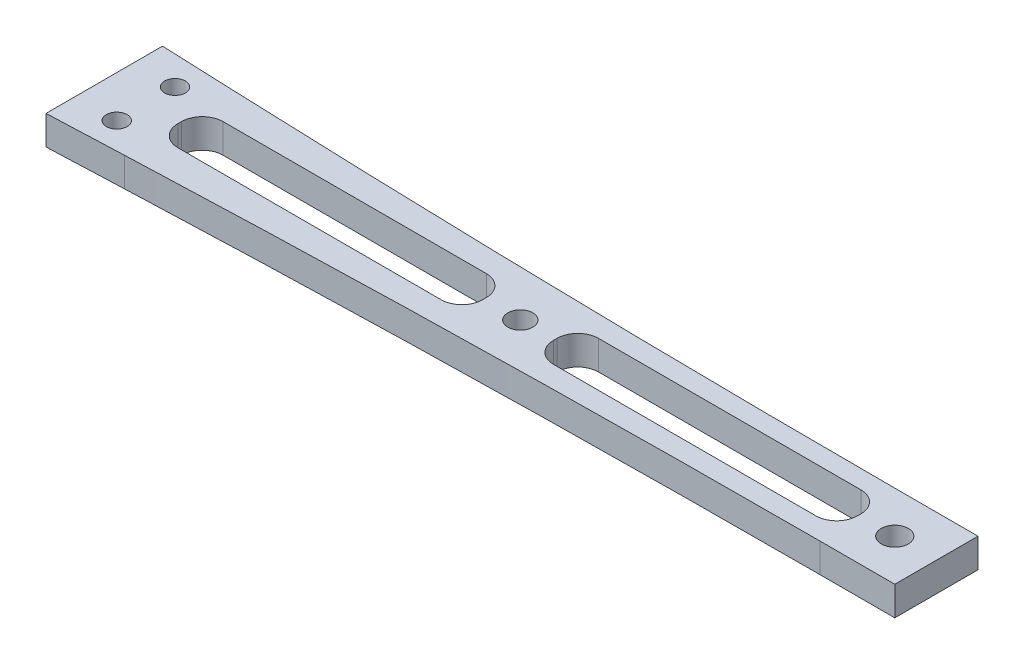
ISO-10303-21;
HEADER;
FILE_DESCRIPTION(('STEP AP214'),'2;1');
FILE_NAME('part.step','',(''),(''),'','','');
FILE_SCHEMA(('AUTOMOTIVE_DESIGN { 1 0 10303 214 1 1 1 1 }'));
ENDSEC;
DATA;
#1=APPLICATION_CONTEXT('core data for automotive mechanical design processes');
#2=APPLICATION_PROTOCOL_DEFINITION('international standard','automotive_design',2000,#1);
#3=PRODUCT_CONTEXT('',#1,'mechanical');
#4=PRODUCT('Part','Part','',(#3));
#5=PRODUCT_RELATED_PRODUCT_CATEGORY('part','',(#4));
#6=PRODUCT_DEFINITION_FORMATION('','',#4);
#7=PRODUCT_DEFINITION_CONTEXT('part definition',#1,'design');
#8=PRODUCT_DEFINITION('design','',#6,#7);
#9=PRODUCT_DEFINITION_SHAPE('','',#8);
#10=(LENGTH_UNIT() NAMED_UNIT(*) SI_UNIT(.MILLI.,.METRE.));
#11=(NAMED_UNIT(*) PLANE_ANGLE_UNIT() SI_UNIT($,.RADIAN.));
#12=(NAMED_UNIT(*) SI_UNIT($,.STERADIAN.) SOLID_ANGLE_UNIT());
#13=UNCERTAINTY_MEASURE_WITH_UNIT(LENGTH_MEASURE(1.E-05),#10,'distance_accuracy_value','');
#14=(GEOMETRIC_REPRESENTATION_CONTEXT(3) GLOBAL_UNCERTAINTY_ASSIGNED_CONTEXT((#13)) GLOBAL_UNIT_ASSIGNED_CONTEXT((#10,
#11,#12)) REPRESENTATION_CONTEXT('',''));
#15=CARTESIAN_POINT('',(0.,0.,0.));
#16=DIRECTION('',(0.,0.,1.));
#17=DIRECTION('',(1.,0.,0.));
#18=AXIS2_PLACEMENT_3D('',#15,#16,#17);
#19=CARTESIAN_POINT('',(113.225148065724,7.,-10.5745762799879));
#20=DIRECTION('',(0.,-1.,0.));
#21=DIRECTION('',(0.,0.,-1.));
#22=AXIS2_PLACEMENT_3D('',#19,#20,#21);
#23=CYLINDRICAL_SURFACE('',#22,5.00000000000001);
#24=CARTESIAN_POINT('',(113.225148065724,0.,-10.5745762799879));
#25=DIRECTION('',(0.,1.,0.));
#26=DIRECTION('',(0.,0.,1.));
#27=AXIS2_PLACEMENT_3D('',#24,#25,#26);
#28=CIRCLE('',#27,5.00000000000001);
#29=CARTESIAN_POINT('',(113.225148065724,0.,-15.5745762799879));
#30=VERTEX_POINT('',#29);
#31=CARTESIAN_POINT('',(108.225148065724,0.,-10.5745762799879));
#32=VERTEX_POINT('',#31);
#33=EDGE_CURVE('E380',#30,#32,#28,.T.);
#34=ORIENTED_EDGE('',*,*,#33,.F.);
#35=DIRECTION('',(0.,-1.,0.));
#36=VECTOR('',#35,1.);
#37=CARTESIAN_POINT('',(113.225148065724,7.,-15.5745762799879));
#38=LINE('',#37,#36);
#39=CARTESIAN_POINT('',(113.225148065724,7.,-15.5745762799879));
#40=VERTEX_POINT('',#39);
#41=EDGE_CURVE('E250',#40,#30,#38,.T.);
#42=ORIENTED_EDGE('',*,*,#41,.F.);
#43=CARTESIAN_POINT('',(113.225148065724,7.,-10.5745762799879));
#44=DIRECTION('',(0.,1.,0.));
#45=DIRECTION('',(0.,0.,1.));
#46=AXIS2_PLACEMENT_3D('',#43,#44,#45);
#47=CIRCLE('',#46,5.00000000000001);
#48=CARTESIAN_POINT('',(108.225148065724,7.,-10.5745762799879));
#49=VERTEX_POINT('',#48);
#50=EDGE_CURVE('E471',#40,#49,#47,.T.);
#51=ORIENTED_EDGE('',*,*,#50,.T.);
#52=DIRECTION('',(0.,-1.,0.));
#53=VECTOR('',#52,1.);
#54=CARTESIAN_POINT('',(108.225148065724,7.,-10.5745762799879));
#55=LINE('',#54,#53);
#56=EDGE_CURVE('E284',#49,#32,#55,.T.);
#57=ORIENTED_EDGE('',*,*,#56,.T.);
#58=EDGE_LOOP('',(#34,#42,#51,#57));
#59=FACE_BOUND('',#58,.T.);
#60=ADVANCED_FACE('F45',(#59),#23,.F.);
#61=CARTESIAN_POINT('',(0.,7.,-15.5745762799879));
#62=DIRECTION('',(0.,0.,-1.));
#63=DIRECTION('',(-1.,0.,0.));
#64=AXIS2_PLACEMENT_3D('',#61,#62,#63);
#65=PLANE('',#64);
#66=DIRECTION('',(1.,0.,0.));
#67=VECTOR('',#66,1.);
#68=CARTESIAN_POINT('',(0.,0.,-15.5745762799879));
#69=LINE('',#68,#67);
#70=CARTESIAN_POINT('',(176.28620966279,0.,-15.5745762799879));
#71=VERTEX_POINT('',#70);
#72=EDGE_CURVE('E384',#30,#71,#69,.T.);
#73=ORIENTED_EDGE('',*,*,#72,.T.);
#74=DIRECTION('',(0.,-1.,0.));
#75=VECTOR('',#74,1.);
#76=CARTESIAN_POINT('',(176.28620966279,7.,-15.5745762799879));
#77=LINE('',#76,#75);
#78=CARTESIAN_POINT('',(176.28620966279,7.,-15.5745762799879));
#79=VERTEX_POINT('',#78);
#80=EDGE_CURVE('E266',#79,#71,#77,.T.);
#81=ORIENTED_EDGE('',*,*,#80,.F.);
#82=DIRECTION('',(1.,0.,0.));
#83=VECTOR('',#82,1.);
#84=CARTESIAN_POINT('',(0.,7.,-15.5745762799879));
#85=LINE('',#84,#83);
#86=EDGE_CURVE('E475',#40,#79,#85,.T.);
#87=ORIENTED_EDGE('',*,*,#86,.F.);
#88=ORIENTED_EDGE('',*,*,#41,.T.);
#89=EDGE_LOOP('',(#73,#81,#87,#88));
#90=FACE_BOUND('',#89,.T.);
#91=ADVANCED_FACE('F527',(#90),#65,.F.);
#92=CARTESIAN_POINT('',(176.28620966279,7.,-10.5745762799879));
#93=DIRECTION('',(0.,-1.,0.));
#94=DIRECTION('',(0.,0.,-1.));
#95=AXIS2_PLACEMENT_3D('',#92,#93,#94);
#96=CYLINDRICAL_SURFACE('',#95,4.99999999999999);
#97=CARTESIAN_POINT('',(176.28620966279,0.,-10.5745762799879));
#98=DIRECTION('',(0.,1.,0.));
#99=DIRECTION('',(0.,0.,1.));
#100=AXIS2_PLACEMENT_3D('',#97,#98,#99);
#101=CIRCLE('',#100,4.99999999999999);
#102=CARTESIAN_POINT('',(181.28620966279,0.,-10.5745762799879));
#103=VERTEX_POINT('',#102);
#104=EDGE_CURVE('E388',#103,#71,#101,.T.);
#105=ORIENTED_EDGE('',*,*,#104,.F.);
#106=DIRECTION('',(0.,-1.,0.));
#107=VECTOR('',#106,1.);
#108=CARTESIAN_POINT('',(181.28620966279,7.,-10.5745762799879));
#109=LINE('',#108,#107);
#110=CARTESIAN_POINT('',(181.28620966279,7.,-10.5745762799879));
#111=VERTEX_POINT('',#110);
#112=EDGE_CURVE('E269',#111,#103,#109,.T.);
#113=ORIENTED_EDGE('',*,*,#112,.F.);
#114=CARTESIAN_POINT('',(176.28620966279,7.,-10.5745762799879));
#115=DIRECTION('',(0.,1.,0.));
#116=DIRECTION('',(0.,0.,1.));
#117=AXIS2_PLACEMENT_3D('',#114,#115,#116);
#118=CIRCLE('',#117,4.99999999999999);
#119=EDGE_CURVE('E478',#111,#79,#118,.T.);
#120=ORIENTED_EDGE('',*,*,#119,.T.);
#121=ORIENTED_EDGE('',*,*,#80,.T.);
#122=EDGE_LOOP('',(#105,#113,#120,#121));
#123=FACE_BOUND('',#122,.T.);
#124=ADVANCED_FACE('F533',(#123),#96,.F.);
#125=CARTESIAN_POINT('',(181.28620966279,7.,0.));
#126=DIRECTION('',(1.,0.,0.));
#127=DIRECTION('',(0.,0.,-1.));
#128=AXIS2_PLACEMENT_3D('',#125,#126,#127);
#129=PLANE('',#128);
#130=DIRECTION('',(0.,0.,1.));
#131=VECTOR('',#130,1.);
#132=CARTESIAN_POINT('',(181.28620966279,0.,0.));
#133=LINE('',#132,#131);
#134=CARTESIAN_POINT('',(181.28620966279,0.,-9.75277634577933));
#135=VERTEX_POINT('',#134);
#136=EDGE_CURVE('E392',#103,#135,#133,.T.);
#137=ORIENTED_EDGE('',*,*,#136,.T.);
#138=DIRECTION('',(0.,-1.,0.));
#139=VECTOR('',#138,1.);
#140=CARTESIAN_POINT('',(181.28620966279,7.,-9.75277634577933));
#141=LINE('',#140,#139);
#142=CARTESIAN_POINT('',(181.28620966279,7.,-9.75277634577933));
#143=VERTEX_POINT('',#142);
#144=EDGE_CURVE('E272',#143,#135,#141,.T.);
#145=ORIENTED_EDGE('',*,*,#144,.F.);
#146=DIRECTION('',(0.,0.,1.));
#147=VECTOR('',#146,1.);
#148=CARTESIAN_POINT('',(181.28620966279,7.,0.));
#149=LINE('',#148,#147);
#150=EDGE_CURVE('E482',#111,#143,#149,.T.);
#151=ORIENTED_EDGE('',*,*,#150,.F.);
#152=ORIENTED_EDGE('',*,*,#112,.T.);
#153=EDGE_LOOP('',(#137,#145,#151,#152));
#154=FACE_BOUND('',#153,.T.);
#155=ADVANCED_FACE('F635',(#154),#129,.F.);
#156=CARTESIAN_POINT('',(176.28620966279,7.,-9.75277634577931));
#157=DIRECTION('',(0.,-1.,0.));
#158=DIRECTION('',(0.,0.,-1.));
#159=AXIS2_PLACEMENT_3D('',#156,#157,#158);
#160=CYLINDRICAL_SURFACE('',#159,4.99999999999999);
#161=CARTESIAN_POINT('',(176.28620966279,0.,-9.75277634577931));
#162=DIRECTION('',(0.,1.,0.));
#163=DIRECTION('',(0.,0.,1.));
#164=AXIS2_PLACEMENT_3D('',#161,#162,#163);
#165=CIRCLE('',#164,4.99999999999999);
#166=CARTESIAN_POINT('',(176.28620966279,0.,-4.75277634577932));
#167=VERTEX_POINT('',#166);
#168=EDGE_CURVE('E396',#167,#135,#165,.T.);
#169=ORIENTED_EDGE('',*,*,#168,.F.);
#170=DIRECTION('',(0.,-1.,0.));
#171=VECTOR('',#170,1.);
#172=CARTESIAN_POINT('',(176.28620966279,7.,-4.75277634577932));
#173=LINE('',#172,#171);
#174=CARTESIAN_POINT('',(176.28620966279,7.,-4.75277634577932));
#175=VERTEX_POINT('',#174);
#176=EDGE_CURVE('E275',#175,#167,#173,.T.);
#177=ORIENTED_EDGE('',*,*,#176,.F.);
#178=CARTESIAN_POINT('',(176.28620966279,7.,-9.75277634577931));
#179=DIRECTION('',(0.,1.,0.));
#180=DIRECTION('',(0.,0.,1.));
#181=AXIS2_PLACEMENT_3D('',#178,#179,#180);
#182=CIRCLE('',#181,4.99999999999999);
#183=EDGE_CURVE('E485',#175,#143,#182,.T.);
#184=ORIENTED_EDGE('',*,*,#183,.T.);
#185=ORIENTED_EDGE('',*,*,#144,.T.);
#186=EDGE_LOOP('',(#169,#177,#184,#185));
#187=FACE_BOUND('',#186,.T.);
#188=ADVANCED_FACE('F631',(#187),#160,.F.);
#189=CARTESIAN_POINT('',(0.,7.,-4.75277634577934));
#190=DIRECTION('',(0.,0.,-1.));
#191=DIRECTION('',(-1.,0.,0.));
#192=AXIS2_PLACEMENT_3D('',#189,#190,#191);
#193=PLANE('',#192);
#194=DIRECTION('',(1.,0.,0.));
#195=VECTOR('',#194,1.);
#196=CARTESIAN_POINT('',(0.,0.,-4.75277634577934));
#197=LINE('',#196,#195);
#198=CARTESIAN_POINT('',(113.225148065724,0.,-4.75277634577933));
#199=VERTEX_POINT('',#198);
#200=EDGE_CURVE('E400',#199,#167,#197,.T.);
#201=ORIENTED_EDGE('',*,*,#200,.F.);
#202=DIRECTION('',(0.,-1.,0.));
#203=VECTOR('',#202,1.);
#204=CARTESIAN_POINT('',(113.225148065724,7.,-4.75277634577933));
#205=LINE('',#204,#203);
#206=CARTESIAN_POINT('',(113.225148065724,7.,-4.75277634577933));
#207=VERTEX_POINT('',#206);
#208=EDGE_CURVE('E278',#207,#199,#205,.T.);
#209=ORIENTED_EDGE('',*,*,#208,.F.);
#210=DIRECTION('',(1.,0.,0.));
#211=VECTOR('',#210,1.);
#212=CARTESIAN_POINT('',(0.,7.,-4.75277634577934));
#213=LINE('',#212,#211);
#214=EDGE_CURVE('E489',#207,#175,#213,.T.);
#215=ORIENTED_EDGE('',*,*,#214,.T.);
#216=ORIENTED_EDGE('',*,*,#176,.T.);
#217=EDGE_LOOP('',(#201,#209,#215,#216));
#218=FACE_BOUND('',#217,.T.);
#219=ADVANCED_FACE('F627',(#218),#193,.T.);
#220=CARTESIAN_POINT('',(113.225148065724,7.,-9.75277634577931));
#221=DIRECTION('',(0.,-1.,0.));
#222=DIRECTION('',(0.,0.,-1.));
#223=AXIS2_PLACEMENT_3D('',#220,#221,#222);
#224=CYLINDRICAL_SURFACE('',#223,5.);
#225=CARTESIAN_POINT('',(113.225148065724,0.,-9.75277634577931));
#226=DIRECTION('',(0.,1.,0.));
#227=DIRECTION('',(0.,0.,1.));
#228=AXIS2_PLACEMENT_3D('',#225,#226,#227);
#229=CIRCLE('',#228,5.);
#230=CARTESIAN_POINT('',(108.225148065724,0.,-9.75277634577933));
#231=VERTEX_POINT('',#230);
#232=EDGE_CURVE('E404',#199,#231,#229,.F.);
#233=ORIENTED_EDGE('',*,*,#232,.T.);
#234=DIRECTION('',(0.,-1.,0.));
#235=VECTOR('',#234,1.);
#236=CARTESIAN_POINT('',(108.225148065724,7.,-9.75277634577933));
#237=LINE('',#236,#235);
#238=CARTESIAN_POINT('',(108.225148065724,7.,-9.75277634577933));
#239=VERTEX_POINT('',#238);
#240=EDGE_CURVE('E281',#239,#231,#237,.T.);
#241=ORIENTED_EDGE('',*,*,#240,.F.);
#242=CARTESIAN_POINT('',(113.225148065724,7.,-9.75277634577931));
#243=DIRECTION('',(0.,1.,0.));
#244=DIRECTION('',(0.,0.,1.));
#245=AXIS2_PLACEMENT_3D('',#242,#243,#244);
#246=CIRCLE('',#245,5.);
#247=EDGE_CURVE('E493',#207,#239,#246,.F.);
#248=ORIENTED_EDGE('',*,*,#247,.F.);
#249=ORIENTED_EDGE('',*,*,#208,.T.);
#250=EDGE_LOOP('',(#233,#241,#248,#249));
#251=FACE_BOUND('',#250,.T.);
#252=ADVANCED_FACE('F570',(#251),#224,.F.);
#253=CARTESIAN_POINT('',(22.9848223233018,7.,-10.5745762799879));
#254=DIRECTION('',(0.,-1.,0.));
#255=DIRECTION('',(0.,0.,-1.));
#256=AXIS2_PLACEMENT_3D('',#253,#254,#255);
#257=CYLINDRICAL_SURFACE('',#256,5.00000000000001);
#258=CARTESIAN_POINT('',(22.9848223233018,0.,-10.5745762799879));
#259=DIRECTION('',(0.,1.,0.));
#260=DIRECTION('',(0.,0.,1.));
#261=AXIS2_PLACEMENT_3D('',#258,#259,#260);
#262=CIRCLE('',#261,5.00000000000001);
#263=CARTESIAN_POINT('',(22.9848223233018,0.,-15.5745762799879));
#264=VERTEX_POINT('',#263);
#265=CARTESIAN_POINT('',(17.9848223233018,0.,-10.5745762799879));
#266=VERTEX_POINT('',#265);
#267=EDGE_CURVE('E348',#264,#266,#262,.T.);
#268=ORIENTED_EDGE('',*,*,#267,.F.);
#269=DIRECTION('',(0.,-1.,0.));
#270=VECTOR('',#269,1.);
#271=CARTESIAN_POINT('',(22.9848223233018,7.,-15.5745762799879));
#272=LINE('',#271,#270);
#273=CARTESIAN_POINT('',(22.9848223233018,7.,-15.5745762799879));
#274=VERTEX_POINT('',#273);
#275=EDGE_CURVE('E287',#274,#264,#272,.T.);
#276=ORIENTED_EDGE('',*,*,#275,.F.);
#277=CARTESIAN_POINT('',(22.9848223233018,7.,-10.5745762799879));
#278=DIRECTION('',(0.,1.,0.));
#279=DIRECTION('',(0.,0.,1.));
#280=AXIS2_PLACEMENT_3D('',#277,#278,#279);
#281=CIRCLE('',#280,5.00000000000001);
#282=CARTESIAN_POINT('',(17.9848223233018,7.,-10.5745762799879));
#283=VERTEX_POINT('',#282);
#284=EDGE_CURVE('E442',#274,#283,#281,.T.);
#285=ORIENTED_EDGE('',*,*,#284,.T.);
#286=DIRECTION('',(0.,-1.,0.));
#287=VECTOR('',#286,1.);
#288=CARTESIAN_POINT('',(17.9848223233018,7.,-10.5745762799879));
#289=LINE('',#288,#287);
#290=EDGE_CURVE('E236',#283,#266,#289,.T.);
#291=ORIENTED_EDGE('',*,*,#290,.T.);
#292=EDGE_LOOP('',(#268,#276,#285,#291));
#293=FACE_BOUND('',#292,.T.);
#294=ADVANCED_FACE('F566',(#293),#257,.F.);
#295=CARTESIAN_POINT('',(0.,7.,-15.5745762799879));
#296=DIRECTION('',(0.,0.,-1.));
#297=DIRECTION('',(-1.,0.,0.));
#298=AXIS2_PLACEMENT_3D('',#295,#296,#297);
#299=PLANE('',#298);
#300=DIRECTION('',(1.,0.,0.));
#301=VECTOR('',#300,1.);
#302=CARTESIAN_POINT('',(0.,0.,-15.5745762799879));
#303=LINE('',#302,#301);
#304=CARTESIAN_POINT('',(86.2593923796302,0.,-15.5745762799879));
#305=VERTEX_POINT('',#304);
#306=EDGE_CURVE('E352',#264,#305,#303,.T.);
#307=ORIENTED_EDGE('',*,*,#306,.T.);
#308=DIRECTION('',(0.,-1.,0.));
#309=VECTOR('',#308,1.);
#310=CARTESIAN_POINT('',(86.2593923796302,7.,-15.5745762799879));
#311=LINE('',#310,#309);
#312=CARTESIAN_POINT('',(86.2593923796302,7.,-15.5745762799879));
#313=VERTEX_POINT('',#312);
#314=EDGE_CURVE('E290',#313,#305,#311,.T.);
#315=ORIENTED_EDGE('',*,*,#314,.F.);
#316=DIRECTION('',(1.,0.,0.));
#317=VECTOR('',#316,1.);
#318=CARTESIAN_POINT('',(0.,7.,-15.5745762799879));
#319=LINE('',#318,#317);
#320=EDGE_CURVE('E446',#274,#313,#319,.T.);
#321=ORIENTED_EDGE('',*,*,#320,.F.);
#322=ORIENTED_EDGE('',*,*,#275,.T.);
#323=EDGE_LOOP('',(#307,#315,#321,#322));
#324=FACE_BOUND('',#323,.T.);
#325=ADVANCED_FACE('F562',(#324),#299,.F.);
#326=CARTESIAN_POINT('',(86.2593923796302,7.,-10.5745762799879));
#327=DIRECTION('',(0.,-1.,0.));
#328=DIRECTION('',(0.,0.,-1.));
#329=AXIS2_PLACEMENT_3D('',#326,#327,#328);
#330=CYLINDRICAL_SURFACE('',#329,4.99999999999999);
#331=CARTESIAN_POINT('',(86.2593923796302,0.,-10.5745762799879));
#332=DIRECTION('',(0.,1.,0.));
#333=DIRECTION('',(0.,0.,1.));
#334=AXIS2_PLACEMENT_3D('',#331,#332,#333);
#335=CIRCLE('',#334,4.99999999999999);
#336=CARTESIAN_POINT('',(91.2593923796302,0.,-10.5745762799879));
#337=VERTEX_POINT('',#336);
#338=EDGE_CURVE('E356',#337,#305,#335,.T.);
#339=ORIENTED_EDGE('',*,*,#338,.F.);
#340=DIRECTION('',(0.,-1.,0.));
#341=VECTOR('',#340,1.);
#342=CARTESIAN_POINT('',(91.2593923796302,7.,-10.5745762799879));
#343=LINE('',#342,#341);
#344=CARTESIAN_POINT('',(91.2593923796302,7.,-10.5745762799879));
#345=VERTEX_POINT('',#344);
#346=EDGE_CURVE('E293',#345,#337,#343,.T.);
#347=ORIENTED_EDGE('',*,*,#346,.F.);
#348=CARTESIAN_POINT('',(86.2593923796302,7.,-10.5745762799879));
#349=DIRECTION('',(0.,1.,0.));
#350=DIRECTION('',(0.,0.,1.));
#351=AXIS2_PLACEMENT_3D('',#348,#349,#350);
#352=CIRCLE('',#351,4.99999999999999);
#353=EDGE_CURVE('E449',#345,#313,#352,.T.);
#354=ORIENTED_EDGE('',*,*,#353,.T.);
#355=ORIENTED_EDGE('',*,*,#314,.T.);
#356=EDGE_LOOP('',(#339,#347,#354,#355));
#357=FACE_BOUND('',#356,.T.);
#358=ADVANCED_FACE('F558',(#357),#330,.F.);
#359=CARTESIAN_POINT('',(91.2593923796302,7.,0.));
#360=DIRECTION('',(1.,0.,0.));
#361=DIRECTION('',(0.,0.,-1.));
#362=AXIS2_PLACEMENT_3D('',#359,#360,#361);
#363=PLANE('',#362);
#364=DIRECTION('',(0.,0.,1.));
#365=VECTOR('',#364,1.);
#366=CARTESIAN_POINT('',(91.2593923796302,0.,0.));
#367=LINE('',#366,#365);
#368=CARTESIAN_POINT('',(91.2593923796302,0.,-9.69671937911455));
#369=VERTEX_POINT('',#368);
#370=EDGE_CURVE('E360',#337,#369,#367,.T.);
#371=ORIENTED_EDGE('',*,*,#370,.T.);
#372=DIRECTION('',(0.,-1.,0.));
#373=VECTOR('',#372,1.);
#374=CARTESIAN_POINT('',(91.2593923796302,7.,-9.69671937911455));
#375=LINE('',#374,#373);
#376=CARTESIAN_POINT('',(91.2593923796302,7.,-9.69671937911455));
#377=VERTEX_POINT('',#376);
#378=EDGE_CURVE('E296',#377,#369,#375,.T.);
#379=ORIENTED_EDGE('',*,*,#378,.F.);
#380=DIRECTION('',(0.,0.,1.));
#381=VECTOR('',#380,1.);
#382=CARTESIAN_POINT('',(91.2593923796302,7.,0.));
#383=LINE('',#382,#381);
#384=EDGE_CURVE('E453',#345,#377,#383,.T.);
#385=ORIENTED_EDGE('',*,*,#384,.F.);
#386=ORIENTED_EDGE('',*,*,#346,.T.);
#387=EDGE_LOOP('',(#371,#379,#385,#386));
#388=FACE_BOUND('',#387,.T.);
#389=ADVANCED_FACE('F554',(#388),#363,.F.);
#390=CARTESIAN_POINT('',(86.2593923796302,7.,-9.69671937911454));
#391=DIRECTION('',(0.,-1.,0.));
#392=DIRECTION('',(0.,0.,-1.));
#393=AXIS2_PLACEMENT_3D('',#390,#391,#392);
#394=CYLINDRICAL_SURFACE('',#393,4.99999999999999);
#395=CARTESIAN_POINT('',(86.2593923796302,0.,-9.69671937911454));
#396=DIRECTION('',(0.,1.,0.));
#397=DIRECTION('',(0.,0.,1.));
#398=AXIS2_PLACEMENT_3D('',#395,#396,#397);
#399=CIRCLE('',#398,4.99999999999999);
#400=CARTESIAN_POINT('',(86.2593923796302,0.,-4.69671937911453));
#401=VERTEX_POINT('',#400);
#402=EDGE_CURVE('E364',#401,#369,#399,.T.);
#403=ORIENTED_EDGE('',*,*,#402,.F.);
#404=DIRECTION('',(0.,-1.,0.));
#405=VECTOR('',#404,1.);
#406=CARTESIAN_POINT('',(86.2593923796302,7.,-4.69671937911453));
#407=LINE('',#406,#405);
#408=CARTESIAN_POINT('',(86.2593923796302,7.,-4.69671937911453));
#409=VERTEX_POINT('',#408);
#410=EDGE_CURVE('E299',#409,#401,#407,.T.);
#411=ORIENTED_EDGE('',*,*,#410,.F.);
#412=CARTESIAN_POINT('',(86.2593923796302,7.,-9.69671937911454));
#413=DIRECTION('',(0.,1.,0.));
#414=DIRECTION('',(0.,0.,1.));
#415=AXIS2_PLACEMENT_3D('',#412,#413,#414);
#416=CIRCLE('',#415,4.99999999999999);
#417=EDGE_CURVE('E456',#409,#377,#416,.T.);
#418=ORIENTED_EDGE('',*,*,#417,.T.);
#419=ORIENTED_EDGE('',*,*,#378,.T.);
#420=EDGE_LOOP('',(#403,#411,#418,#419));
#421=FACE_BOUND('',#420,.T.);
#422=ADVANCED_FACE('F550',(#421),#394,.F.);
#423=CARTESIAN_POINT('',(0.,7.,-4.69671937911455));
#424=DIRECTION('',(0.,0.,-1.));
#425=DIRECTION('',(-1.,0.,0.));
#426=AXIS2_PLACEMENT_3D('',#423,#424,#425);
#427=PLANE('',#426);
#428=DIRECTION('',(1.,0.,0.));
#429=VECTOR('',#428,1.);
#430=CARTESIAN_POINT('',(0.,0.,-4.69671937911455));
#431=LINE('',#430,#429);
#432=CARTESIAN_POINT('',(22.9848223233018,0.,-4.69671937911455));
#433=VERTEX_POINT('',#432);
#434=EDGE_CURVE('E368',#433,#401,#431,.T.);
#435=ORIENTED_EDGE('',*,*,#434,.F.);
#436=DIRECTION('',(0.,-1.,0.));
#437=VECTOR('',#436,1.);
#438=CARTESIAN_POINT('',(22.9848223233018,7.,-4.69671937911455));
#439=LINE('',#438,#437);
#440=CARTESIAN_POINT('',(22.9848223233018,7.,-4.69671937911455));
#441=VERTEX_POINT('',#440);
#442=EDGE_CURVE('E302',#441,#433,#439,.T.);
#443=ORIENTED_EDGE('',*,*,#442,.F.);
#444=DIRECTION('',(1.,0.,0.));
#445=VECTOR('',#444,1.);
#446=CARTESIAN_POINT('',(0.,7.,-4.69671937911455));
#447=LINE('',#446,#445);
#448=EDGE_CURVE('E460',#441,#409,#447,.T.);
#449=ORIENTED_EDGE('',*,*,#448,.T.);
#450=ORIENTED_EDGE('',*,*,#410,.T.);
#451=EDGE_LOOP('',(#435,#443,#449,#450));
#452=FACE_BOUND('',#451,.T.);
#453=ADVANCED_FACE('F546',(#452),#427,.T.);
#454=CARTESIAN_POINT('',(22.9848223233018,7.,-9.69671937911454));
#455=DIRECTION('',(0.,-1.,0.));
#456=DIRECTION('',(0.,0.,-1.));
#457=AXIS2_PLACEMENT_3D('',#454,#455,#456);
#458=CYLINDRICAL_SURFACE('',#457,5.);
#459=CARTESIAN_POINT('',(22.9848223233018,0.,-9.69671937911454));
#460=DIRECTION('',(0.,1.,0.));
#461=DIRECTION('',(0.,0.,1.));
#462=AXIS2_PLACEMENT_3D('',#459,#460,#461);
#463=CIRCLE('',#462,5.);
#464=CARTESIAN_POINT('',(17.9848223233018,0.,-9.69671937911455));
#465=VERTEX_POINT('',#464);
#466=EDGE_CURVE('E372',#465,#433,#463,.T.);
#467=ORIENTED_EDGE('',*,*,#466,.F.);
#468=DIRECTION('',(0.,-1.,0.));
#469=VECTOR('',#468,1.);
#470=CARTESIAN_POINT('',(17.9848223233018,7.,-9.69671937911455));
#471=LINE('',#470,#469);
#472=CARTESIAN_POINT('',(17.9848223233018,7.,-9.69671937911455));
#473=VERTEX_POINT('',#472);
#474=EDGE_CURVE('E240',#473,#465,#471,.T.);
#475=ORIENTED_EDGE('',*,*,#474,.F.);
#476=CARTESIAN_POINT('',(22.9848223233018,7.,-9.69671937911454));
#477=DIRECTION('',(0.,1.,0.));
#478=DIRECTION('',(0.,0.,1.));
#479=AXIS2_PLACEMENT_3D('',#476,#477,#478);
#480=CIRCLE('',#479,5.);
#481=EDGE_CURVE('E464',#473,#441,#480,.T.);
#482=ORIENTED_EDGE('',*,*,#481,.T.);
#483=ORIENTED_EDGE('',*,*,#442,.T.);
#484=EDGE_LOOP('',(#467,#475,#482,#483));
#485=FACE_BOUND('',#484,.T.);
#486=ADVANCED_FACE('F543',(#485),#458,.F.);
#487=CARTESIAN_POINT('',(0.958466453674131,7.,-23.961661341853));
#488=DIRECTION('',(-0.039968038348872,0.,0.999200958721789));
#489=DIRECTION('',(0.999200958721789,0.,0.039968038348872));
#490=AXIS2_PLACEMENT_3D('',#487,#488,#489);
#491=PLANE('',#490);
#492=DIRECTION('',(-0.999200958721789,0.,-0.039968038348872));
#493=VECTOR('',#492,1.);
#494=CARTESIAN_POINT('',(0.958466453674131,7.,-23.961661341853));
#495=LINE('',#494,#493);
#496=CARTESIAN_POINT('',(18.0982689834271,7.,-23.2760692406629));
#497=VERTEX_POINT('',#496);
#498=CARTESIAN_POINT('',(0.,7.,-24.));
#499=VERTEX_POINT('',#498);
#500=EDGE_CURVE('E206',#497,#499,#495,.T.);
#501=ORIENTED_EDGE('',*,*,#500,.F.);
#502=DIRECTION('',(0.,-1.,0.));
#503=VECTOR('',#502,1.);
#504=CARTESIAN_POINT('',(18.0982689834271,0.,-23.2760692406629));
#505=LINE('',#504,#503);
#506=CARTESIAN_POINT('',(18.0982689834271,0.,-23.2760692406629));
#507=VERTEX_POINT('',#506);
#508=EDGE_CURVE('E246',#497,#507,#505,.T.);
#509=ORIENTED_EDGE('',*,*,#508,.T.);
#510=DIRECTION('',(-0.999200958721789,0.,-0.039968038348872));
#511=VECTOR('',#510,1.);
#512=CARTESIAN_POINT('',(0.958466453674131,0.,-23.961661341853));
#513=LINE('',#512,#511);
#514=CARTESIAN_POINT('',(0.,0.,-24.));
#515=VERTEX_POINT('',#514);
#516=EDGE_CURVE('E233',#507,#515,#513,.T.);
#517=ORIENTED_EDGE('',*,*,#516,.T.);
#518=DIRECTION('',(0.,-1.,0.));
#519=VECTOR('',#518,1.);
#520=CARTESIAN_POINT('',(0.,7.,-24.));
#521=LINE('',#520,#519);
#522=EDGE_CURVE('E225',#499,#515,#521,.T.);
#523=ORIENTED_EDGE('',*,*,#522,.F.);
#524=EDGE_LOOP('',(#501,#509,#517,#523));
#525=FACE_BOUND('',#524,.T.);
#526=ADVANCED_FACE('F231',(#525),#491,.F.);
#527=CARTESIAN_POINT('',(0.,7.,0.));
#528=DIRECTION('',(1.,0.,0.));
#529=DIRECTION('',(0.,0.,-1.));
#530=AXIS2_PLACEMENT_3D('',#527,#528,#529);
#531=PLANE('',#530);
#532=DIRECTION('',(0.,0.,1.));
#533=VECTOR('',#532,1.);
#534=CARTESIAN_POINT('',(0.,0.,0.));
#535=LINE('',#534,#533);
#536=CARTESIAN_POINT('',(0.,0.,4.));
#537=VERTEX_POINT('',#536);
#538=EDGE_CURVE('E342',#515,#537,#535,.T.);
#539=ORIENTED_EDGE('',*,*,#538,.T.);
#540=DIRECTION('',(0.,-1.,0.));
#541=VECTOR('',#540,1.);
#542=CARTESIAN_POINT('',(0.,7.,4.));
#543=LINE('',#542,#541);
#544=CARTESIAN_POINT('',(0.,7.,4.));
#545=VERTEX_POINT('',#544);
#546=EDGE_CURVE('E227',#545,#537,#543,.T.);
#547=ORIENTED_EDGE('',*,*,#546,.F.);
#548=DIRECTION('',(0.,0.,1.));
#549=VECTOR('',#548,1.);
#550=CARTESIAN_POINT('',(0.,7.,0.));
#551=LINE('',#550,#549);
#552=EDGE_CURVE('E211',#499,#545,#551,.T.);
#553=ORIENTED_EDGE('',*,*,#552,.F.);
#554=ORIENTED_EDGE('',*,*,#522,.T.);
#555=EDGE_LOOP('',(#539,#547,#553,#554));
#556=FACE_BOUND('',#555,.T.);
#557=ADVANCED_FACE('F224',(#556),#531,.F.);
#558=CARTESIAN_POINT('',(0.159744408945687,7.,3.99361022364217));
#559=DIRECTION('',(-0.0399680383488716,0.,-0.999200958721789));
#560=DIRECTION('',(-0.999200958721789,0.,0.0399680383488716));
#561=AXIS2_PLACEMENT_3D('',#558,#559,#560);
#562=PLANE('',#561);
#563=DIRECTION('',(0.99920095872179,0.,-0.0399680383488716));
#564=VECTOR('',#563,1.);
#565=CARTESIAN_POINT('',(0.159744408945687,0.,3.99361022364217));
#566=LINE('',#565,#564);
#567=CARTESIAN_POINT('',(18.0982689834047,0.,3.27606924066381));
#568=VERTEX_POINT('',#567);
#569=EDGE_CURVE('E339',#537,#568,#566,.T.);
#570=ORIENTED_EDGE('',*,*,#569,.T.);
#571=DIRECTION('',(0.,-1.,0.));
#572=VECTOR('',#571,1.);
#573=CARTESIAN_POINT('',(18.0982689834047,7.,3.27606924066381));
#574=LINE('',#573,#572);
#575=CARTESIAN_POINT('',(18.0982689834047,7.,3.27606924066381));
#576=VERTEX_POINT('',#575);
#577=EDGE_CURVE('E61',#568,#576,#574,.F.);
#578=ORIENTED_EDGE('',*,*,#577,.T.);
#579=DIRECTION('',(0.99920095872179,0.,-0.0399680383488716));
#580=VECTOR('',#579,1.);
#581=CARTESIAN_POINT('',(0.159744408945687,7.,3.99361022364217));
#582=LINE('',#581,#580);
#583=EDGE_CURVE('E229',#545,#576,#582,.T.);
#584=ORIENTED_EDGE('',*,*,#583,.F.);
#585=ORIENTED_EDGE('',*,*,#546,.T.);
#586=EDGE_LOOP('',(#570,#578,#584,#585));
#587=FACE_BOUND('',#586,.T.);
#588=ADVANCED_FACE('F517',(#587),#562,.F.);
#589=CARTESIAN_POINT('',(0.,7.,0.));
#590=DIRECTION('',(0.,0.,1.));
#591=DIRECTION('',(1.,0.,0.));
#592=AXIS2_PLACEMENT_3D('',#589,#590,#591);
#593=PLANE('',#592);
#594=DIRECTION('',(-1.,0.,0.));
#595=VECTOR('',#594,1.);
#596=CARTESIAN_POINT('',(0.,7.,0.));
#597=LINE('',#596,#595);
#598=CARTESIAN_POINT('',(200.,7.,0.));
#599=VERTEX_POINT('',#598);
#600=CARTESIAN_POINT('',(181.967226213776,7.,0.));
#601=VERTEX_POINT('',#600);
#602=EDGE_CURVE('E434',#599,#601,#597,.T.);
#603=ORIENTED_EDGE('',*,*,#602,.T.);
#604=DIRECTION('',(0.,-1.,0.));
#605=VECTOR('',#604,1.);
#606=CARTESIAN_POINT('',(181.967226213776,7.,0.));
#607=LINE('',#606,#605);
#608=CARTESIAN_POINT('',(181.967226213776,0.,0.));
#609=VERTEX_POINT('',#608);
#610=EDGE_CURVE('E253',#601,#609,#607,.T.);
#611=ORIENTED_EDGE('',*,*,#610,.T.);
#612=DIRECTION('',(-1.,0.,0.));
#613=VECTOR('',#612,1.);
#614=CARTESIAN_POINT('',(0.,0.,0.));
#615=LINE('',#614,#613);
#616=CARTESIAN_POINT('',(200.,0.,0.));
#617=VERTEX_POINT('',#616);
#618=EDGE_CURVE('E331',#617,#609,#615,.T.);
#619=ORIENTED_EDGE('',*,*,#618,.F.);
#620=DIRECTION('',(0.,-1.,0.));
#621=VECTOR('',#620,1.);
#622=CARTESIAN_POINT('',(200.,7.,0.));
#623=LINE('',#622,#621);
#624=EDGE_CURVE('E242',#599,#617,#623,.T.);
#625=ORIENTED_EDGE('',*,*,#624,.F.);
#626=EDGE_LOOP('',(#603,#611,#619,#625));
#627=FACE_BOUND('',#626,.T.);
#628=ADVANCED_FACE('F336',(#627),#593,.T.);
#629=CARTESIAN_POINT('',(200.,7.,0.));
#630=DIRECTION('',(-1.,0.,0.));
#631=DIRECTION('',(0.,0.,1.));
#632=AXIS2_PLACEMENT_3D('',#629,#630,#631);
#633=PLANE('',#632);
#634=DIRECTION('',(0.,0.,-1.));
#635=VECTOR('',#634,1.);
#636=CARTESIAN_POINT('',(200.,0.,0.));
#637=LINE('',#636,#635);
#638=CARTESIAN_POINT('',(200.,0.,-20.));
#639=VERTEX_POINT('',#638);
#640=EDGE_CURVE('E322',#617,#639,#637,.T.);
#641=ORIENTED_EDGE('',*,*,#640,.T.);
#642=DIRECTION('',(0.,-1.,0.));
#643=VECTOR('',#642,1.);
#644=CARTESIAN_POINT('',(200.,7.,-20.));
#645=LINE('',#644,#643);
#646=CARTESIAN_POINT('',(200.,7.,-20.));
#647=VERTEX_POINT('',#646);
#648=EDGE_CURVE('E312',#647,#639,#645,.T.);
#649=ORIENTED_EDGE('',*,*,#648,.F.);
#650=DIRECTION('',(0.,0.,-1.));
#651=VECTOR('',#650,1.);
#652=CARTESIAN_POINT('',(200.,7.,0.));
#653=LINE('',#652,#651);
#654=EDGE_CURVE('E323',#599,#647,#653,.T.);
#655=ORIENTED_EDGE('',*,*,#654,.F.);
#656=ORIENTED_EDGE('',*,*,#624,.T.);
#657=EDGE_LOOP('',(#641,#649,#655,#656));
#658=FACE_BOUND('',#657,.T.);
#659=ADVANCED_FACE('F320',(#658),#633,.F.);
#660=CARTESIAN_POINT('',(17.9848223233018,7.,0.));
#661=DIRECTION('',(1.,0.,0.));
#662=DIRECTION('',(0.,0.,-1.));
#663=AXIS2_PLACEMENT_3D('',#660,#661,#662);
#664=PLANE('',#663);
#665=DIRECTION('',(0.,0.,1.));
#666=VECTOR('',#665,1.);
#667=CARTESIAN_POINT('',(17.9848223233018,0.,0.));
#668=LINE('',#667,#666);
#669=EDGE_CURVE('E376',#266,#465,#668,.T.);
#670=ORIENTED_EDGE('',*,*,#669,.F.);
#671=ORIENTED_EDGE('',*,*,#290,.F.);
#672=DIRECTION('',(0.,0.,1.));
#673=VECTOR('',#672,1.);
#674=CARTESIAN_POINT('',(17.9848223233018,7.,0.));
#675=LINE('',#674,#673);
#676=EDGE_CURVE('E468',#283,#473,#675,.T.);
#677=ORIENTED_EDGE('',*,*,#676,.T.);
#678=ORIENTED_EDGE('',*,*,#474,.T.);
#679=EDGE_LOOP('',(#670,#671,#677,#678));
#680=FACE_BOUND('',#679,.T.);
#681=ADVANCED_FACE('F539',(#680),#664,.T.);
#682=CARTESIAN_POINT('',(0.,7.,-20.));
#683=DIRECTION('',(0.,0.,1.));
#684=DIRECTION('',(1.,0.,0.));
#685=AXIS2_PLACEMENT_3D('',#682,#683,#684);
#686=PLANE('',#685);
#687=DIRECTION('',(-1.,0.,0.));
#688=VECTOR('',#687,1.);
#689=CARTESIAN_POINT('',(0.,0.,-20.));
#690=LINE('',#689,#688);
#691=CARTESIAN_POINT('',(181.967226213802,0.,-20.));
#692=VERTEX_POINT('',#691);
#693=EDGE_CURVE('E333',#639,#692,#690,.T.);
#694=ORIENTED_EDGE('',*,*,#693,.T.);
#695=DIRECTION('',(0.,-1.,0.));
#696=VECTOR('',#695,1.);
#697=CARTESIAN_POINT('',(181.967226213802,7.,-20.));
#698=LINE('',#697,#696);
#699=CARTESIAN_POINT('',(181.967226213802,7.,-20.));
#700=VERTEX_POINT('',#699);
#701=EDGE_CURVE('E249',#692,#700,#698,.F.);
#702=ORIENTED_EDGE('',*,*,#701,.T.);
#703=DIRECTION('',(-1.,0.,0.));
#704=VECTOR('',#703,1.);
#705=CARTESIAN_POINT('',(0.,7.,-20.));
#706=LINE('',#705,#704);
#707=EDGE_CURVE('E439',#647,#700,#706,.T.);
#708=ORIENTED_EDGE('',*,*,#707,.F.);
#709=ORIENTED_EDGE('',*,*,#648,.T.);
#710=EDGE_LOOP('',(#694,#702,#708,#709));
#711=FACE_BOUND('',#710,.T.);
#712=ADVANCED_FACE('F542',(#711),#686,.F.);
#713=CARTESIAN_POINT('',(10.,7.,-17.));
#714=DIRECTION('',(0.,-1.,0.));
#715=DIRECTION('',(0.,0.,-1.));
#716=AXIS2_PLACEMENT_3D('',#713,#714,#715);
#717=CYLINDRICAL_SURFACE('',#716,2.5);
#718=CARTESIAN_POINT('',(10.,7.,-17.));
#719=DIRECTION('',(0.,1.,0.));
#720=DIRECTION('',(0.,0.,1.));
#721=AXIS2_PLACEMENT_3D('',#718,#719,#720);
#722=CIRCLE('',#721,2.5);
#723=CARTESIAN_POINT('',(10.,7.,-14.5));
#724=VERTEX_POINT('',#723);
#725=EDGE_CURVE('E220',#724,#724,#722,.T.);
#726=ORIENTED_EDGE('',*,*,#725,.T.);
#727=EDGE_LOOP('',(#726));
#728=FACE_BOUND('',#727,.T.);
#729=CARTESIAN_POINT('',(10.,0.,-17.));
#730=DIRECTION('',(0.,1.,0.));
#731=DIRECTION('',(0.,0.,1.));
#732=AXIS2_PLACEMENT_3D('',#729,#730,#731);
#733=CIRCLE('',#732,2.5);
#734=CARTESIAN_POINT('',(10.,0.,-14.5));
#735=VERTEX_POINT('',#734);
#736=EDGE_CURVE('E511',#735,#735,#733,.T.);
#737=ORIENTED_EDGE('',*,*,#736,.F.);
#738=EDGE_LOOP('',(#737));
#739=FACE_BOUND('',#738,.T.);
#740=ADVANCED_FACE('F574',(#728,#739),#717,.F.);
#741=CARTESIAN_POINT('',(190.,7.,-10.));
#742=DIRECTION('',(0.,-1.,0.));
#743=DIRECTION('',(0.,0.,-1.));
#744=AXIS2_PLACEMENT_3D('',#741,#742,#743);
#745=CYLINDRICAL_SURFACE('',#744,3.25000000000001);
#746=CARTESIAN_POINT('',(190.,7.,-10.));
#747=DIRECTION('',(0.,1.,0.));
#748=DIRECTION('',(0.,0.,1.));
#749=AXIS2_PLACEMENT_3D('',#746,#747,#748);
#750=CIRCLE('',#749,3.25000000000001);
#751=CARTESIAN_POINT('',(190.,7.,-6.74999999999999));
#752=VERTEX_POINT('',#751);
#753=EDGE_CURVE('E423',#752,#752,#750,.T.);
#754=ORIENTED_EDGE('',*,*,#753,.T.);
#755=EDGE_LOOP('',(#754));
#756=FACE_BOUND('',#755,.T.);
#757=CARTESIAN_POINT('',(190.,0.,-10.));
#758=DIRECTION('',(0.,1.,0.));
#759=DIRECTION('',(0.,0.,1.));
#760=AXIS2_PLACEMENT_3D('',#757,#758,#759);
#761=CIRCLE('',#760,3.25000000000001);
#762=CARTESIAN_POINT('',(190.,0.,-6.74999999999999));
#763=VERTEX_POINT('',#762);
#764=EDGE_CURVE('E507',#763,#763,#761,.T.);
#765=ORIENTED_EDGE('',*,*,#764,.F.);
#766=EDGE_LOOP('',(#765));
#767=FACE_BOUND('',#766,.T.);
#768=ADVANCED_FACE('F588',(#756,#767),#745,.F.);
#769=CARTESIAN_POINT('',(100.,7.,-9.99999999999999));
#770=DIRECTION('',(0.,-1.,0.));
#771=DIRECTION('',(0.,0.,-1.));
#772=AXIS2_PLACEMENT_3D('',#769,#770,#771);
#773=CYLINDRICAL_SURFACE('',#772,3.00000000000001);
#774=CARTESIAN_POINT('',(100.,7.,-9.99999999999999));
#775=DIRECTION('',(0.,1.,0.));
#776=DIRECTION('',(0.,0.,1.));
#777=AXIS2_PLACEMENT_3D('',#774,#775,#776);
#778=CIRCLE('',#777,3.00000000000001);
#779=CARTESIAN_POINT('',(100.,7.,-6.99999999999998));
#780=VERTEX_POINT('',#779);
#781=EDGE_CURVE('E417',#780,#780,#778,.T.);
#782=ORIENTED_EDGE('',*,*,#781,.T.);
#783=EDGE_LOOP('',(#782));
#784=FACE_BOUND('',#783,.T.);
#785=CARTESIAN_POINT('',(100.,0.,-9.99999999999999));
#786=DIRECTION('',(0.,1.,0.));
#787=DIRECTION('',(0.,0.,1.));
#788=AXIS2_PLACEMENT_3D('',#785,#786,#787);
#789=CIRCLE('',#788,3.00000000000001);
#790=CARTESIAN_POINT('',(100.,0.,-6.99999999999998));
#791=VERTEX_POINT('',#790);
#792=EDGE_CURVE('E503',#791,#791,#789,.T.);
#793=ORIENTED_EDGE('',*,*,#792,.F.);
#794=EDGE_LOOP('',(#793));
#795=FACE_BOUND('',#794,.T.);
#796=ADVANCED_FACE('F592',(#784,#795),#773,.F.);
#797=CARTESIAN_POINT('',(10.,7.,-3.));
#798=DIRECTION('',(0.,-1.,0.));
#799=DIRECTION('',(0.,0.,-1.));
#800=AXIS2_PLACEMENT_3D('',#797,#798,#799);
#801=CYLINDRICAL_SURFACE('',#800,2.5);
#802=CARTESIAN_POINT('',(10.,7.,-3.));
#803=DIRECTION('',(0.,1.,0.));
#804=DIRECTION('',(0.,0.,1.));
#805=AXIS2_PLACEMENT_3D('',#802,#803,#804);
#806=CIRCLE('',#805,2.5);
#807=CARTESIAN_POINT('',(10.,7.,-0.5));
#808=VERTEX_POINT('',#807);
#809=EDGE_CURVE('E411',#808,#808,#806,.T.);
#810=ORIENTED_EDGE('',*,*,#809,.T.);
#811=EDGE_LOOP('',(#810));
#812=FACE_BOUND('',#811,.T.);
#813=CARTESIAN_POINT('',(10.,0.,-3.));
#814=DIRECTION('',(0.,1.,0.));
#815=DIRECTION('',(0.,0.,1.));
#816=AXIS2_PLACEMENT_3D('',#813,#814,#815);
#817=CIRCLE('',#816,2.5);
#818=CARTESIAN_POINT('',(10.,0.,-0.5));
#819=VERTEX_POINT('',#818);
#820=EDGE_CURVE('E499',#819,#819,#817,.T.);
#821=ORIENTED_EDGE('',*,*,#820,.F.);
#822=EDGE_LOOP('',(#821));
#823=FACE_BOUND('',#822,.T.);
#824=ADVANCED_FACE('F596',(#812,#823),#801,.F.);
#825=CARTESIAN_POINT('',(108.225148065724,7.,0.));
#826=DIRECTION('',(1.,0.,0.));
#827=DIRECTION('',(0.,0.,-1.));
#828=AXIS2_PLACEMENT_3D('',#825,#826,#827);
#829=PLANE('',#828);
#830=DIRECTION('',(0.,0.,1.));
#831=VECTOR('',#830,1.);
#832=CARTESIAN_POINT('',(108.225148065724,0.,0.));
#833=LINE('',#832,#831);
#834=EDGE_CURVE('E408',#32,#231,#833,.T.);
#835=ORIENTED_EDGE('',*,*,#834,.F.);
#836=ORIENTED_EDGE('',*,*,#56,.F.);
#837=DIRECTION('',(0.,0.,1.));
#838=VECTOR('',#837,1.);
#839=CARTESIAN_POINT('',(108.225148065724,7.,0.));
#840=LINE('',#839,#838);
#841=EDGE_CURVE('E315',#49,#239,#840,.T.);
#842=ORIENTED_EDGE('',*,*,#841,.T.);
#843=ORIENTED_EDGE('',*,*,#240,.T.);
#844=EDGE_LOOP('',(#835,#836,#842,#843));
#845=FACE_BOUND('',#844,.T.);
#846=ADVANCED_FACE('F599',(#845),#829,.T.);
#847=CARTESIAN_POINT('',(0.,7.,0.));
#848=DIRECTION('',(0.,1.,0.));
#849=DIRECTION('',(0.,0.,1.));
#850=AXIS2_PLACEMENT_3D('',#847,#848,#849);
#851=PLANE('',#850);
#852=ORIENTED_EDGE('',*,*,#809,.F.);
#853=EDGE_LOOP('',(#852));
#854=FACE_BOUND('',#853,.T.);
#855=ORIENTED_EDGE('',*,*,#781,.F.);
#856=EDGE_LOOP('',(#855));
#857=FACE_BOUND('',#856,.T.);
#858=ORIENTED_EDGE('',*,*,#753,.F.);
#859=EDGE_LOOP('',(#858));
#860=FACE_BOUND('',#859,.T.);
#861=ORIENTED_EDGE('',*,*,#725,.F.);
#862=EDGE_LOOP('',(#861));
#863=FACE_BOUND('',#862,.T.);
#864=ORIENTED_EDGE('',*,*,#707,.T.);
#865=CARTESIAN_POINT('',(181.967226213802,7.,-4120.));
#866=DIRECTION('',(0.,1.,0.));
#867=DIRECTION('',(0.,0.,1.));
#868=AXIS2_PLACEMENT_3D('',#865,#866,#867);
#869=CIRCLE('',#868,4100.);
#870=EDGE_CURVE('E214',#700,#497,#869,.F.);
#871=ORIENTED_EDGE('',*,*,#870,.T.);
#872=ORIENTED_EDGE('',*,*,#500,.T.);
#873=ORIENTED_EDGE('',*,*,#552,.T.);
#874=ORIENTED_EDGE('',*,*,#583,.T.);
#875=CARTESIAN_POINT('',(181.967226213778,7.,4100.));
#876=DIRECTION('',(0.,1.,0.));
#877=DIRECTION('',(0.,0.,1.));
#878=AXIS2_PLACEMENT_3D('',#875,#876,#877);
#879=CIRCLE('',#878,4100.);
#880=EDGE_CURVE('E11',#576,#601,#879,.F.);
#881=ORIENTED_EDGE('',*,*,#880,.T.);
#882=ORIENTED_EDGE('',*,*,#602,.F.);
#883=ORIENTED_EDGE('',*,*,#654,.T.);
#884=EDGE_LOOP('',(#864,#871,#872,#873,#874,#881,#882,#883));
#885=FACE_BOUND('',#884,.T.);
#886=ORIENTED_EDGE('',*,*,#284,.F.);
#887=ORIENTED_EDGE('',*,*,#320,.T.);
#888=ORIENTED_EDGE('',*,*,#353,.F.);
#889=ORIENTED_EDGE('',*,*,#384,.T.);
#890=ORIENTED_EDGE('',*,*,#417,.F.);
#891=ORIENTED_EDGE('',*,*,#448,.F.);
#892=ORIENTED_EDGE('',*,*,#481,.F.);
#893=ORIENTED_EDGE('',*,*,#676,.F.);
#894=EDGE_LOOP('',(#886,#887,#888,#889,#890,#891,#892,#893));
#895=FACE_BOUND('',#894,.T.);
#896=ORIENTED_EDGE('',*,*,#50,.F.);
#897=ORIENTED_EDGE('',*,*,#86,.T.);
#898=ORIENTED_EDGE('',*,*,#119,.F.);
#899=ORIENTED_EDGE('',*,*,#150,.T.);
#900=ORIENTED_EDGE('',*,*,#183,.F.);
#901=ORIENTED_EDGE('',*,*,#214,.F.);
#902=ORIENTED_EDGE('',*,*,#247,.T.);
#903=ORIENTED_EDGE('',*,*,#841,.F.);
#904=EDGE_LOOP('',(#896,#897,#898,#899,#900,#901,#902,#903));
#905=FACE_BOUND('',#904,.T.);
#906=ADVANCED_FACE('F209',(#854,#857,#860,#863,#885,#895,#905),#851,.T.);
#907=CARTESIAN_POINT('',(0.,0.,0.));
#908=DIRECTION('',(0.,1.,0.));
#909=DIRECTION('',(0.,0.,1.));
#910=AXIS2_PLACEMENT_3D('',#907,#908,#909);
#911=PLANE('',#910);
#912=ORIENTED_EDGE('',*,*,#820,.T.);
#913=EDGE_LOOP('',(#912));
#914=FACE_BOUND('',#913,.T.);
#915=ORIENTED_EDGE('',*,*,#792,.T.);
#916=EDGE_LOOP('',(#915));
#917=FACE_BOUND('',#916,.T.);
#918=ORIENTED_EDGE('',*,*,#764,.T.);
#919=EDGE_LOOP('',(#918));
#920=FACE_BOUND('',#919,.T.);
#921=ORIENTED_EDGE('',*,*,#736,.T.);
#922=EDGE_LOOP('',(#921));
#923=FACE_BOUND('',#922,.T.);
#924=ORIENTED_EDGE('',*,*,#516,.F.);
#925=CARTESIAN_POINT('',(181.967226213802,0.,-4120.));
#926=DIRECTION('',(0.,1.,0.));
#927=DIRECTION('',(0.,0.,1.));
#928=AXIS2_PLACEMENT_3D('',#925,#926,#927);
#929=CIRCLE('',#928,4100.);
#930=EDGE_CURVE('E259',#507,#692,#929,.T.);
#931=ORIENTED_EDGE('',*,*,#930,.T.);
#932=ORIENTED_EDGE('',*,*,#693,.F.);
#933=ORIENTED_EDGE('',*,*,#640,.F.);
#934=ORIENTED_EDGE('',*,*,#618,.T.);
#935=CARTESIAN_POINT('',(181.967226213778,0.,4100.));
#936=DIRECTION('',(0.,1.,0.));
#937=DIRECTION('',(0.,0.,1.));
#938=AXIS2_PLACEMENT_3D('',#935,#936,#937);
#939=CIRCLE('',#938,4100.);
#940=EDGE_CURVE('E54',#609,#568,#939,.T.);
#941=ORIENTED_EDGE('',*,*,#940,.T.);
#942=ORIENTED_EDGE('',*,*,#569,.F.);
#943=ORIENTED_EDGE('',*,*,#538,.F.);
#944=EDGE_LOOP('',(#924,#931,#932,#933,#934,#941,#942,#943));
#945=FACE_BOUND('',#944,.T.);
#946=ORIENTED_EDGE('',*,*,#267,.T.);
#947=ORIENTED_EDGE('',*,*,#669,.T.);
#948=ORIENTED_EDGE('',*,*,#466,.T.);
#949=ORIENTED_EDGE('',*,*,#434,.T.);
#950=ORIENTED_EDGE('',*,*,#402,.T.);
#951=ORIENTED_EDGE('',*,*,#370,.F.);
#952=ORIENTED_EDGE('',*,*,#338,.T.);
#953=ORIENTED_EDGE('',*,*,#306,.F.);
#954=EDGE_LOOP('',(#946,#947,#948,#949,#950,#951,#952,#953));
#955=FACE_BOUND('',#954,.T.);
#956=ORIENTED_EDGE('',*,*,#33,.T.);
#957=ORIENTED_EDGE('',*,*,#834,.T.);
#958=ORIENTED_EDGE('',*,*,#232,.F.);
#959=ORIENTED_EDGE('',*,*,#200,.T.);
#960=ORIENTED_EDGE('',*,*,#168,.T.);
#961=ORIENTED_EDGE('',*,*,#136,.F.);
#962=ORIENTED_EDGE('',*,*,#104,.T.);
#963=ORIENTED_EDGE('',*,*,#72,.F.);
#964=EDGE_LOOP('',(#956,#957,#958,#959,#960,#961,#962,#963));
#965=FACE_BOUND('',#964,.T.);
#966=ADVANCED_FACE('F329',(#914,#917,#920,#923,#945,#955,#965),#911,.F.);
#967=CARTESIAN_POINT('',(181.967226213802,7.,-4120.));
#968=DIRECTION('',(0.,1.,0.));
#969=DIRECTION('',(0.,0.,1.));
#970=AXIS2_PLACEMENT_3D('',#967,#968,#969);
#971=CYLINDRICAL_SURFACE('',#970,4100.);
#972=ORIENTED_EDGE('',*,*,#870,.F.);
#973=ORIENTED_EDGE('',*,*,#701,.F.);
#974=ORIENTED_EDGE('',*,*,#930,.F.);
#975=ORIENTED_EDGE('',*,*,#508,.F.);
#976=EDGE_LOOP('',(#972,#973,#974,#975));
#977=FACE_BOUND('',#976,.T.);
#978=ADVANCED_FACE('F521',(#977),#971,.F.);
#979=CARTESIAN_POINT('',(181.967226213778,7.,4100.));
#980=DIRECTION('',(0.,-1.,0.));
#981=DIRECTION('',(0.,0.,-1.));
#982=AXIS2_PLACEMENT_3D('',#979,#980,#981);
#983=CYLINDRICAL_SURFACE('',#982,4100.);
#984=ORIENTED_EDGE('',*,*,#880,.F.);
#985=ORIENTED_EDGE('',*,*,#577,.F.);
#986=ORIENTED_EDGE('',*,*,#940,.F.);
#987=ORIENTED_EDGE('',*,*,#610,.F.);
#988=EDGE_LOOP('',(#984,#985,#986,#987));
#989=FACE_BOUND('',#988,.T.);
#990=ADVANCED_FACE('F47',(#989),#983,.F.);
#991=CLOSED_SHELL('',(#60,#91,#124,#155,#188,#219,#252,#294,#325,#358,#389,#422,#453,#486,#526,
#557,#588,#628,#659,#681,#712,#740,#768,#796,#824,#846,#906,#966,#978,#990));
#992=MANIFOLD_SOLID_BREP('B2',#991);
#993=ADVANCED_BREP_SHAPE_REPRESENTATION('',(#18,#992),#14);
#994=SHAPE_DEFINITION_REPRESENTATION(#9,#993);
ENDSEC;
END-ISO-10303-21;
